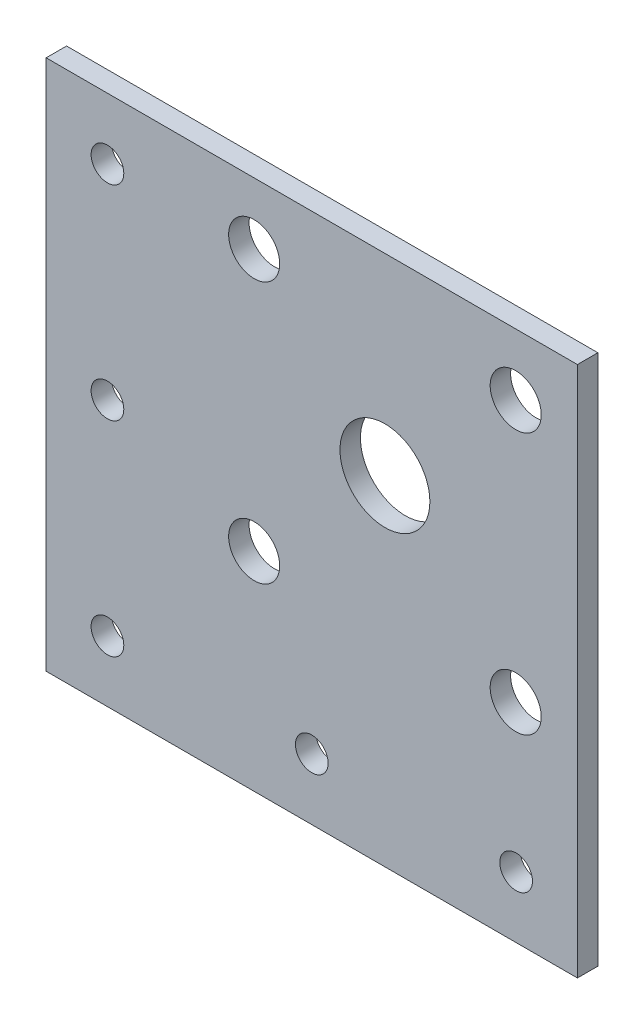
ISO-10303-21;
HEADER;
FILE_DESCRIPTION(('STEP AP214'),'2;1');
FILE_NAME('part.step','',(''),(''),'','','');
FILE_SCHEMA(('AUTOMOTIVE_DESIGN { 1 0 10303 214 1 1 1 1 }'));
ENDSEC;
DATA;
#1=APPLICATION_CONTEXT('core data for automotive mechanical design processes');
#2=APPLICATION_PROTOCOL_DEFINITION('international standard','automotive_design',2000,#1);
#3=PRODUCT_CONTEXT('',#1,'mechanical');
#4=PRODUCT('Part','Part','',(#3));
#5=PRODUCT_RELATED_PRODUCT_CATEGORY('part','',(#4));
#6=PRODUCT_DEFINITION_FORMATION('','',#4);
#7=PRODUCT_DEFINITION_CONTEXT('part definition',#1,'design');
#8=PRODUCT_DEFINITION('design','',#6,#7);
#9=PRODUCT_DEFINITION_SHAPE('','',#8);
#10=(LENGTH_UNIT() NAMED_UNIT(*) SI_UNIT(.MILLI.,.METRE.));
#11=(NAMED_UNIT(*) PLANE_ANGLE_UNIT() SI_UNIT($,.RADIAN.));
#12=(NAMED_UNIT(*) SI_UNIT($,.STERADIAN.) SOLID_ANGLE_UNIT());
#13=UNCERTAINTY_MEASURE_WITH_UNIT(LENGTH_MEASURE(1.E-05),#10,'distance_accuracy_value','');
#14=(GEOMETRIC_REPRESENTATION_CONTEXT(3) GLOBAL_UNCERTAINTY_ASSIGNED_CONTEXT((#13)) GLOBAL_UNIT_ASSIGNED_CONTEXT((#10,
#11,#12)) REPRESENTATION_CONTEXT('',''));
#15=CARTESIAN_POINT('',(0.,0.,0.));
#16=DIRECTION('',(0.,0.,1.));
#17=DIRECTION('',(1.,0.,0.));
#18=AXIS2_PLACEMENT_3D('',#15,#16,#17);
#19=CARTESIAN_POINT('',(0.,-82.9000000000001,5.));
#20=DIRECTION('',(0.,1.,0.));
#21=DIRECTION('',(0.,0.,1.));
#22=AXIS2_PLACEMENT_3D('',#19,#20,#21);
#23=PLANE('',#22);
#24=DIRECTION('',(1.,0.,0.));
#25=VECTOR('',#24,1.);
#26=CARTESIAN_POINT('',(0.,-82.9000000000001,0.));
#27=LINE('',#26,#25);
#28=CARTESIAN_POINT('',(-82.9,-82.9000000000001,0.));
#29=VERTEX_POINT('',#28);
#30=CARTESIAN_POINT('',(47.1000000000004,-82.9000000000001,0.));
#31=VERTEX_POINT('',#30);
#32=EDGE_CURVE('E150',#29,#31,#27,.T.);
#33=ORIENTED_EDGE('',*,*,#32,.T.);
#34=DIRECTION('',(0.,0.,-1.));
#35=VECTOR('',#34,1.);
#36=CARTESIAN_POINT('',(47.1000000000004,-82.9000000000001,5.));
#37=LINE('',#36,#35);
#38=CARTESIAN_POINT('',(47.1000000000004,-82.9000000000001,5.));
#39=VERTEX_POINT('',#38);
#40=EDGE_CURVE('E11',#39,#31,#37,.T.);
#41=ORIENTED_EDGE('',*,*,#40,.F.);
#42=DIRECTION('',(1.,0.,0.));
#43=VECTOR('',#42,1.);
#44=CARTESIAN_POINT('',(0.,-82.9000000000001,5.));
#45=LINE('',#44,#43);
#46=CARTESIAN_POINT('',(-82.9,-82.9000000000001,5.));
#47=VERTEX_POINT('',#46);
#48=EDGE_CURVE('E91',#47,#39,#45,.T.);
#49=ORIENTED_EDGE('',*,*,#48,.F.);
#50=DIRECTION('',(0.,0.,-1.));
#51=VECTOR('',#50,1.);
#52=CARTESIAN_POINT('',(-82.9,-82.9000000000001,5.));
#53=LINE('',#52,#51);
#54=EDGE_CURVE('E137',#47,#29,#53,.T.);
#55=ORIENTED_EDGE('',*,*,#54,.T.);
#56=EDGE_LOOP('',(#33,#41,#49,#55));
#57=FACE_BOUND('',#56,.T.);
#58=ADVANCED_FACE('F41',(#57),#23,.F.);
#59=CARTESIAN_POINT('',(47.1000000000004,0.,5.));
#60=DIRECTION('',(-1.,0.,0.));
#61=DIRECTION('',(0.,0.,1.));
#62=AXIS2_PLACEMENT_3D('',#59,#60,#61);
#63=PLANE('',#62);
#64=DIRECTION('',(0.,1.,0.));
#65=VECTOR('',#64,1.);
#66=CARTESIAN_POINT('',(47.1000000000004,0.,0.));
#67=LINE('',#66,#65);
#68=CARTESIAN_POINT('',(47.1000000000004,47.0999999999999,0.));
#69=VERTEX_POINT('',#68);
#70=EDGE_CURVE('E97',#31,#69,#67,.T.);
#71=ORIENTED_EDGE('',*,*,#70,.T.);
#72=DIRECTION('',(0.,0.,-1.));
#73=VECTOR('',#72,1.);
#74=CARTESIAN_POINT('',(47.1000000000004,47.0999999999999,5.));
#75=LINE('',#74,#73);
#76=CARTESIAN_POINT('',(47.1000000000004,47.0999999999999,5.));
#77=VERTEX_POINT('',#76);
#78=EDGE_CURVE('E51',#77,#69,#75,.T.);
#79=ORIENTED_EDGE('',*,*,#78,.F.);
#80=DIRECTION('',(0.,1.,0.));
#81=VECTOR('',#80,1.);
#82=CARTESIAN_POINT('',(47.1000000000004,0.,5.));
#83=LINE('',#82,#81);
#84=EDGE_CURVE('E85',#39,#77,#83,.T.);
#85=ORIENTED_EDGE('',*,*,#84,.F.);
#86=ORIENTED_EDGE('',*,*,#40,.T.);
#87=EDGE_LOOP('',(#71,#79,#85,#86));
#88=FACE_BOUND('',#87,.T.);
#89=ADVANCED_FACE('F96',(#88),#63,.F.);
#90=CARTESIAN_POINT('',(0.,47.0999999999999,5.));
#91=DIRECTION('',(0.,1.,0.));
#92=DIRECTION('',(0.,0.,1.));
#93=AXIS2_PLACEMENT_3D('',#90,#91,#92);
#94=PLANE('',#93);
#95=DIRECTION('',(1.,0.,0.));
#96=VECTOR('',#95,1.);
#97=CARTESIAN_POINT('',(0.,47.0999999999999,0.));
#98=LINE('',#97,#96);
#99=CARTESIAN_POINT('',(-82.8999999999996,47.0999999999999,0.));
#100=VERTEX_POINT('',#99);
#101=EDGE_CURVE('E156',#100,#69,#98,.T.);
#102=ORIENTED_EDGE('',*,*,#101,.F.);
#103=DIRECTION('',(0.,0.,-1.));
#104=VECTOR('',#103,1.);
#105=CARTESIAN_POINT('',(-82.8999999999996,47.0999999999999,5.));
#106=LINE('',#105,#104);
#107=CARTESIAN_POINT('',(-82.8999999999996,47.0999999999999,5.));
#108=VERTEX_POINT('',#107);
#109=EDGE_CURVE('E75',#108,#100,#106,.T.);
#110=ORIENTED_EDGE('',*,*,#109,.F.);
#111=DIRECTION('',(1.,0.,0.));
#112=VECTOR('',#111,1.);
#113=CARTESIAN_POINT('',(0.,47.0999999999999,5.));
#114=LINE('',#113,#112);
#115=EDGE_CURVE('E89',#108,#77,#114,.T.);
#116=ORIENTED_EDGE('',*,*,#115,.T.);
#117=ORIENTED_EDGE('',*,*,#78,.T.);
#118=EDGE_LOOP('',(#102,#110,#116,#117));
#119=FACE_BOUND('',#118,.T.);
#120=ADVANCED_FACE('F102',(#119),#94,.T.);
#121=CARTESIAN_POINT('',(-67.8999999999996,-17.9000000000001,5.));
#122=DIRECTION('',(0.,0.,-1.));
#123=DIRECTION('',(-1.,0.,0.));
#124=AXIS2_PLACEMENT_3D('',#121,#122,#123);
#125=CYLINDRICAL_SURFACE('',#124,4.00000000000001);
#126=CARTESIAN_POINT('',(-67.8999999999996,-17.9000000000001,5.));
#127=DIRECTION('',(0.,0.,1.));
#128=DIRECTION('',(1.,0.,0.));
#129=AXIS2_PLACEMENT_3D('',#126,#127,#128);
#130=CIRCLE('',#129,4.00000000000001);
#131=CARTESIAN_POINT('',(-63.8999999999996,-17.9000000000001,5.));
#132=VERTEX_POINT('',#131);
#133=EDGE_CURVE('E129',#132,#132,#130,.T.);
#134=ORIENTED_EDGE('',*,*,#133,.T.);
#135=EDGE_LOOP('',(#134));
#136=FACE_BOUND('',#135,.T.);
#137=CARTESIAN_POINT('',(-67.8999999999996,-17.9000000000001,0.));
#138=DIRECTION('',(0.,0.,1.));
#139=DIRECTION('',(1.,0.,0.));
#140=AXIS2_PLACEMENT_3D('',#137,#138,#139);
#141=CIRCLE('',#140,4.00000000000001);
#142=CARTESIAN_POINT('',(-63.8999999999996,-17.9000000000001,0.));
#143=VERTEX_POINT('',#142);
#144=EDGE_CURVE('E181',#143,#143,#141,.T.);
#145=ORIENTED_EDGE('',*,*,#144,.F.);
#146=EDGE_LOOP('',(#145));
#147=FACE_BOUND('',#146,.T.);
#148=ADVANCED_FACE('F359',(#136,#147),#125,.F.);
#149=CARTESIAN_POINT('',(-67.8999999999996,32.0999999999999,5.));
#150=DIRECTION('',(0.,0.,-1.));
#151=DIRECTION('',(-1.,0.,0.));
#152=AXIS2_PLACEMENT_3D('',#149,#150,#151);
#153=CYLINDRICAL_SURFACE('',#152,4.00000000000001);
#154=CARTESIAN_POINT('',(-67.8999999999996,32.0999999999999,5.));
#155=DIRECTION('',(0.,0.,1.));
#156=DIRECTION('',(1.,0.,0.));
#157=AXIS2_PLACEMENT_3D('',#154,#155,#156);
#158=CIRCLE('',#157,4.00000000000001);
#159=CARTESIAN_POINT('',(-63.8999999999996,32.0999999999999,5.));
#160=VERTEX_POINT('',#159);
#161=EDGE_CURVE('E125',#160,#160,#158,.T.);
#162=ORIENTED_EDGE('',*,*,#161,.T.);
#163=EDGE_LOOP('',(#162));
#164=FACE_BOUND('',#163,.T.);
#165=CARTESIAN_POINT('',(-67.8999999999996,32.0999999999999,0.));
#166=DIRECTION('',(0.,0.,1.));
#167=DIRECTION('',(1.,0.,0.));
#168=AXIS2_PLACEMENT_3D('',#165,#166,#167);
#169=CIRCLE('',#168,4.00000000000001);
#170=CARTESIAN_POINT('',(-63.8999999999996,32.0999999999999,0.));
#171=VERTEX_POINT('',#170);
#172=EDGE_CURVE('E177',#171,#171,#169,.T.);
#173=ORIENTED_EDGE('',*,*,#172,.F.);
#174=EDGE_LOOP('',(#173));
#175=FACE_BOUND('',#174,.T.);
#176=ADVANCED_FACE('F349',(#164,#175),#153,.F.);
#177=CARTESIAN_POINT('',(32.,-32.0000000000004,5.));
#178=DIRECTION('',(0.,0.,-1.));
#179=DIRECTION('',(-1.,0.,0.));
#180=AXIS2_PLACEMENT_3D('',#177,#178,#179);
#181=CYLINDRICAL_SURFACE('',#180,6.25);
#182=CARTESIAN_POINT('',(32.,-32.0000000000004,5.));
#183=DIRECTION('',(0.,0.,1.));
#184=DIRECTION('',(1.,0.,0.));
#185=AXIS2_PLACEMENT_3D('',#182,#183,#184);
#186=CIRCLE('',#185,6.25);
#187=CARTESIAN_POINT('',(38.25,-32.0000000000004,5.));
#188=VERTEX_POINT('',#187);
#189=EDGE_CURVE('E121',#188,#188,#186,.T.);
#190=ORIENTED_EDGE('',*,*,#189,.T.);
#191=EDGE_LOOP('',(#190));
#192=FACE_BOUND('',#191,.T.);
#193=CARTESIAN_POINT('',(32.,-32.0000000000004,0.));
#194=DIRECTION('',(0.,0.,1.));
#195=DIRECTION('',(1.,0.,0.));
#196=AXIS2_PLACEMENT_3D('',#193,#194,#195);
#197=CIRCLE('',#196,6.25);
#198=CARTESIAN_POINT('',(38.25,-32.0000000000004,0.));
#199=VERTEX_POINT('',#198);
#200=EDGE_CURVE('E173',#199,#199,#197,.T.);
#201=ORIENTED_EDGE('',*,*,#200,.F.);
#202=EDGE_LOOP('',(#201));
#203=FACE_BOUND('',#202,.T.);
#204=ADVANCED_FACE('F339',(#192,#203),#181,.F.);
#205=CARTESIAN_POINT('',(32.,31.9999999999996,5.));
#206=DIRECTION('',(0.,0.,-1.));
#207=DIRECTION('',(-1.,0.,0.));
#208=AXIS2_PLACEMENT_3D('',#205,#206,#207);
#209=CYLINDRICAL_SURFACE('',#208,6.25);
#210=CARTESIAN_POINT('',(32.,31.9999999999996,5.));
#211=DIRECTION('',(0.,0.,1.));
#212=DIRECTION('',(1.,0.,0.));
#213=AXIS2_PLACEMENT_3D('',#210,#211,#212);
#214=CIRCLE('',#213,6.25);
#215=CARTESIAN_POINT('',(38.25,31.9999999999996,5.));
#216=VERTEX_POINT('',#215);
#217=EDGE_CURVE('E117',#216,#216,#214,.T.);
#218=ORIENTED_EDGE('',*,*,#217,.T.);
#219=EDGE_LOOP('',(#218));
#220=FACE_BOUND('',#219,.T.);
#221=CARTESIAN_POINT('',(32.,31.9999999999996,0.));
#222=DIRECTION('',(0.,0.,1.));
#223=DIRECTION('',(1.,0.,0.));
#224=AXIS2_PLACEMENT_3D('',#221,#222,#223);
#225=CIRCLE('',#224,6.25);
#226=CARTESIAN_POINT('',(38.25,31.9999999999996,0.));
#227=VERTEX_POINT('',#226);
#228=EDGE_CURVE('E169',#227,#227,#225,.T.);
#229=ORIENTED_EDGE('',*,*,#228,.F.);
#230=EDGE_LOOP('',(#229));
#231=FACE_BOUND('',#230,.T.);
#232=ADVANCED_FACE('F329',(#220,#231),#209,.F.);
#233=CARTESIAN_POINT('',(-32.,31.9999999999996,5.));
#234=DIRECTION('',(0.,0.,-1.));
#235=DIRECTION('',(-1.,0.,0.));
#236=AXIS2_PLACEMENT_3D('',#233,#234,#235);
#237=CYLINDRICAL_SURFACE('',#236,6.25000000000001);
#238=CARTESIAN_POINT('',(-32.,31.9999999999996,5.));
#239=DIRECTION('',(0.,0.,1.));
#240=DIRECTION('',(1.,0.,0.));
#241=AXIS2_PLACEMENT_3D('',#238,#239,#240);
#242=CIRCLE('',#241,6.25000000000001);
#243=CARTESIAN_POINT('',(-25.75,31.9999999999996,5.));
#244=VERTEX_POINT('',#243);
#245=EDGE_CURVE('E113',#244,#244,#242,.T.);
#246=ORIENTED_EDGE('',*,*,#245,.T.);
#247=EDGE_LOOP('',(#246));
#248=FACE_BOUND('',#247,.T.);
#249=CARTESIAN_POINT('',(-32.,31.9999999999996,0.));
#250=DIRECTION('',(0.,0.,1.));
#251=DIRECTION('',(1.,0.,0.));
#252=AXIS2_PLACEMENT_3D('',#249,#250,#251);
#253=CIRCLE('',#252,6.25000000000001);
#254=CARTESIAN_POINT('',(-25.75,31.9999999999996,0.));
#255=VERTEX_POINT('',#254);
#256=EDGE_CURVE('E165',#255,#255,#253,.T.);
#257=ORIENTED_EDGE('',*,*,#256,.F.);
#258=EDGE_LOOP('',(#257));
#259=FACE_BOUND('',#258,.T.);
#260=ADVANCED_FACE('F319',(#248,#259),#237,.F.);
#261=CARTESIAN_POINT('',(-32.,-32.0000000000004,5.));
#262=DIRECTION('',(0.,0.,-1.));
#263=DIRECTION('',(-1.,0.,0.));
#264=AXIS2_PLACEMENT_3D('',#261,#262,#263);
#265=CYLINDRICAL_SURFACE('',#264,6.25);
#266=CARTESIAN_POINT('',(-32.,-32.0000000000004,5.));
#267=DIRECTION('',(0.,0.,1.));
#268=DIRECTION('',(1.,0.,0.));
#269=AXIS2_PLACEMENT_3D('',#266,#267,#268);
#270=CIRCLE('',#269,6.25);
#271=CARTESIAN_POINT('',(-25.75,-32.0000000000004,5.));
#272=VERTEX_POINT('',#271);
#273=EDGE_CURVE('E106',#272,#272,#270,.T.);
#274=ORIENTED_EDGE('',*,*,#273,.T.);
#275=EDGE_LOOP('',(#274));
#276=FACE_BOUND('',#275,.T.);
#277=CARTESIAN_POINT('',(-32.,-32.0000000000004,0.));
#278=DIRECTION('',(0.,0.,1.));
#279=DIRECTION('',(1.,0.,0.));
#280=AXIS2_PLACEMENT_3D('',#277,#278,#279);
#281=CIRCLE('',#280,6.25);
#282=CARTESIAN_POINT('',(-25.75,-32.0000000000004,0.));
#283=VERTEX_POINT('',#282);
#284=EDGE_CURVE('E161',#283,#283,#281,.T.);
#285=ORIENTED_EDGE('',*,*,#284,.F.);
#286=EDGE_LOOP('',(#285));
#287=FACE_BOUND('',#286,.T.);
#288=ADVANCED_FACE('F308',(#276,#287),#265,.F.);
#289=CARTESIAN_POINT('',(-82.8999999999997,2.6549275598488E-13,5.));
#290=DIRECTION('',(1.,0.,0.));
#291=DIRECTION('',(0.,1.,0.));
#292=AXIS2_PLACEMENT_3D('',#289,#290,#291);
#293=PLANE('',#292);
#294=DIRECTION('',(0.,-1.,0.));
#295=VECTOR('',#294,1.);
#296=CARTESIAN_POINT('',(-82.8999999999997,2.6549275598488E-13,0.));
#297=LINE('',#296,#295);
#298=EDGE_CURVE('E78',#100,#29,#297,.T.);
#299=ORIENTED_EDGE('',*,*,#298,.T.);
#300=ORIENTED_EDGE('',*,*,#54,.F.);
#301=DIRECTION('',(0.,-1.,0.));
#302=VECTOR('',#301,1.);
#303=CARTESIAN_POINT('',(-82.8999999999997,2.6549275598488E-13,5.));
#304=LINE('',#303,#302);
#305=EDGE_CURVE('E59',#108,#47,#304,.T.);
#306=ORIENTED_EDGE('',*,*,#305,.F.);
#307=ORIENTED_EDGE('',*,*,#109,.T.);
#308=EDGE_LOOP('',(#299,#300,#306,#307));
#309=FACE_BOUND('',#308,.T.);
#310=ADVANCED_FACE('F239',(#309),#293,.F.);
#311=CARTESIAN_POINT('',(-17.8999999999996,-67.9000000000001,5.));
#312=DIRECTION('',(0.,0.,-1.));
#313=DIRECTION('',(-1.,0.,0.));
#314=AXIS2_PLACEMENT_3D('',#311,#312,#313);
#315=CYLINDRICAL_SURFACE('',#314,4.);
#316=CARTESIAN_POINT('',(-17.8999999999996,-67.9000000000001,5.));
#317=DIRECTION('',(0.,0.,1.));
#318=DIRECTION('',(1.,0.,0.));
#319=AXIS2_PLACEMENT_3D('',#316,#317,#318);
#320=CIRCLE('',#319,4.);
#321=CARTESIAN_POINT('',(-13.8999999999996,-67.9000000000001,5.));
#322=VERTEX_POINT('',#321);
#323=EDGE_CURVE('E256',#322,#322,#320,.T.);
#324=ORIENTED_EDGE('',*,*,#323,.T.);
#325=EDGE_LOOP('',(#324));
#326=FACE_BOUND('',#325,.T.);
#327=CARTESIAN_POINT('',(-17.8999999999996,-67.9000000000001,0.));
#328=DIRECTION('',(0.,0.,1.));
#329=DIRECTION('',(1.,0.,0.));
#330=AXIS2_PLACEMENT_3D('',#327,#328,#329);
#331=CIRCLE('',#330,4.);
#332=CARTESIAN_POINT('',(-13.8999999999996,-67.9000000000001,0.));
#333=VERTEX_POINT('',#332);
#334=EDGE_CURVE('E146',#333,#333,#331,.T.);
#335=ORIENTED_EDGE('',*,*,#334,.F.);
#336=EDGE_LOOP('',(#335));
#337=FACE_BOUND('',#336,.T.);
#338=ADVANCED_FACE('F237',(#326,#337),#315,.F.);
#339=CARTESIAN_POINT('',(32.1000000000004,-67.9000000000001,5.));
#340=DIRECTION('',(0.,0.,-1.));
#341=DIRECTION('',(-1.,0.,0.));
#342=AXIS2_PLACEMENT_3D('',#339,#340,#341);
#343=CYLINDRICAL_SURFACE('',#342,3.99999999999999);
#344=CARTESIAN_POINT('',(32.1000000000004,-67.9000000000001,5.));
#345=DIRECTION('',(0.,0.,1.));
#346=DIRECTION('',(1.,0.,0.));
#347=AXIS2_PLACEMENT_3D('',#344,#345,#346);
#348=CIRCLE('',#347,3.99999999999999);
#349=CARTESIAN_POINT('',(36.1000000000004,-67.9000000000001,5.));
#350=VERTEX_POINT('',#349);
#351=EDGE_CURVE('E248',#350,#350,#348,.T.);
#352=ORIENTED_EDGE('',*,*,#351,.T.);
#353=EDGE_LOOP('',(#352));
#354=FACE_BOUND('',#353,.T.);
#355=CARTESIAN_POINT('',(32.1000000000004,-67.9000000000001,0.));
#356=DIRECTION('',(0.,0.,1.));
#357=DIRECTION('',(1.,0.,0.));
#358=AXIS2_PLACEMENT_3D('',#355,#356,#357);
#359=CIRCLE('',#358,3.99999999999999);
#360=CARTESIAN_POINT('',(36.1000000000004,-67.9000000000001,0.));
#361=VERTEX_POINT('',#360);
#362=EDGE_CURVE('E142',#361,#361,#359,.T.);
#363=ORIENTED_EDGE('',*,*,#362,.F.);
#364=EDGE_LOOP('',(#363));
#365=FACE_BOUND('',#364,.T.);
#366=ADVANCED_FACE('F225',(#354,#365),#343,.F.);
#367=CARTESIAN_POINT('',(0.,0.,5.));
#368=DIRECTION('',(0.,0.,-1.));
#369=DIRECTION('',(-1.,0.,0.));
#370=AXIS2_PLACEMENT_3D('',#367,#368,#369);
#371=CYLINDRICAL_SURFACE('',#370,11.);
#372=CARTESIAN_POINT('',(0.,0.,5.));
#373=DIRECTION('',(0.,0.,1.));
#374=DIRECTION('',(1.,0.,0.));
#375=AXIS2_PLACEMENT_3D('',#372,#373,#374);
#376=CIRCLE('',#375,11.);
#377=CARTESIAN_POINT('',(11.,0.,5.));
#378=VERTEX_POINT('',#377);
#379=EDGE_CURVE('E189',#378,#378,#376,.T.);
#380=ORIENTED_EDGE('',*,*,#379,.T.);
#381=EDGE_LOOP('',(#380));
#382=FACE_BOUND('',#381,.T.);
#383=CARTESIAN_POINT('',(0.,0.,0.));
#384=DIRECTION('',(0.,0.,1.));
#385=DIRECTION('',(1.,0.,0.));
#386=AXIS2_PLACEMENT_3D('',#383,#384,#385);
#387=CIRCLE('',#386,11.);
#388=CARTESIAN_POINT('',(11.,0.,0.));
#389=VERTEX_POINT('',#388);
#390=EDGE_CURVE('E138',#389,#389,#387,.T.);
#391=ORIENTED_EDGE('',*,*,#390,.F.);
#392=EDGE_LOOP('',(#391));
#393=FACE_BOUND('',#392,.T.);
#394=ADVANCED_FACE('F43',(#382,#393),#371,.F.);
#395=CARTESIAN_POINT('',(-67.8999999999996,-67.9000000000001,5.));
#396=DIRECTION('',(0.,0.,-1.));
#397=DIRECTION('',(-1.,0.,0.));
#398=AXIS2_PLACEMENT_3D('',#395,#396,#397);
#399=CYLINDRICAL_SURFACE('',#398,4.00000000000001);
#400=CARTESIAN_POINT('',(-67.8999999999996,-67.9000000000001,5.));
#401=DIRECTION('',(0.,0.,1.));
#402=DIRECTION('',(1.,0.,0.));
#403=AXIS2_PLACEMENT_3D('',#400,#401,#402);
#404=CIRCLE('',#403,4.00000000000001);
#405=CARTESIAN_POINT('',(-63.8999999999996,-67.9000000000001,5.));
#406=VERTEX_POINT('',#405);
#407=EDGE_CURVE('E133',#406,#406,#404,.F.);
#408=ORIENTED_EDGE('',*,*,#407,.F.);
#409=EDGE_LOOP('',(#408));
#410=FACE_BOUND('',#409,.T.);
#411=CARTESIAN_POINT('',(-67.8999999999996,-67.9000000000001,0.));
#412=DIRECTION('',(0.,0.,1.));
#413=DIRECTION('',(1.,0.,0.));
#414=AXIS2_PLACEMENT_3D('',#411,#412,#413);
#415=CIRCLE('',#414,4.00000000000001);
#416=CARTESIAN_POINT('',(-63.8999999999996,-67.9000000000001,0.));
#417=VERTEX_POINT('',#416);
#418=EDGE_CURVE('E185',#417,#417,#415,.F.);
#419=ORIENTED_EDGE('',*,*,#418,.T.);
#420=EDGE_LOOP('',(#419));
#421=FACE_BOUND('',#420,.T.);
#422=ADVANCED_FACE('F215',(#410,#421),#399,.F.);
#423=CARTESIAN_POINT('',(0.,0.,5.));
#424=DIRECTION('',(0.,0.,1.));
#425=DIRECTION('',(1.,0.,0.));
#426=AXIS2_PLACEMENT_3D('',#423,#424,#425);
#427=PLANE('',#426);
#428=ORIENTED_EDGE('',*,*,#379,.F.);
#429=EDGE_LOOP('',(#428));
#430=FACE_BOUND('',#429,.T.);
#431=ORIENTED_EDGE('',*,*,#351,.F.);
#432=EDGE_LOOP('',(#431));
#433=FACE_BOUND('',#432,.T.);
#434=ORIENTED_EDGE('',*,*,#323,.F.);
#435=EDGE_LOOP('',(#434));
#436=FACE_BOUND('',#435,.T.);
#437=ORIENTED_EDGE('',*,*,#48,.T.);
#438=ORIENTED_EDGE('',*,*,#84,.T.);
#439=ORIENTED_EDGE('',*,*,#115,.F.);
#440=ORIENTED_EDGE('',*,*,#305,.T.);
#441=EDGE_LOOP('',(#437,#438,#439,#440));
#442=FACE_BOUND('',#441,.T.);
#443=ORIENTED_EDGE('',*,*,#273,.F.);
#444=EDGE_LOOP('',(#443));
#445=FACE_BOUND('',#444,.T.);
#446=ORIENTED_EDGE('',*,*,#245,.F.);
#447=EDGE_LOOP('',(#446));
#448=FACE_BOUND('',#447,.T.);
#449=ORIENTED_EDGE('',*,*,#217,.F.);
#450=EDGE_LOOP('',(#449));
#451=FACE_BOUND('',#450,.T.);
#452=ORIENTED_EDGE('',*,*,#189,.F.);
#453=EDGE_LOOP('',(#452));
#454=FACE_BOUND('',#453,.T.);
#455=ORIENTED_EDGE('',*,*,#161,.F.);
#456=EDGE_LOOP('',(#455));
#457=FACE_BOUND('',#456,.T.);
#458=ORIENTED_EDGE('',*,*,#133,.F.);
#459=EDGE_LOOP('',(#458));
#460=FACE_BOUND('',#459,.T.);
#461=ORIENTED_EDGE('',*,*,#407,.T.);
#462=EDGE_LOOP('',(#461));
#463=FACE_BOUND('',#462,.T.);
#464=ADVANCED_FACE('F86',(#430,#433,#436,#442,#445,#448,#451,#454,#457,#460,#463),#427,.T.);
#465=CARTESIAN_POINT('',(0.,0.,0.));
#466=DIRECTION('',(0.,0.,1.));
#467=DIRECTION('',(1.,0.,0.));
#468=AXIS2_PLACEMENT_3D('',#465,#466,#467);
#469=PLANE('',#468);
#470=ORIENTED_EDGE('',*,*,#390,.T.);
#471=EDGE_LOOP('',(#470));
#472=FACE_BOUND('',#471,.T.);
#473=ORIENTED_EDGE('',*,*,#362,.T.);
#474=EDGE_LOOP('',(#473));
#475=FACE_BOUND('',#474,.T.);
#476=ORIENTED_EDGE('',*,*,#334,.T.);
#477=EDGE_LOOP('',(#476));
#478=FACE_BOUND('',#477,.T.);
#479=ORIENTED_EDGE('',*,*,#32,.F.);
#480=ORIENTED_EDGE('',*,*,#298,.F.);
#481=ORIENTED_EDGE('',*,*,#101,.T.);
#482=ORIENTED_EDGE('',*,*,#70,.F.);
#483=EDGE_LOOP('',(#479,#480,#481,#482));
#484=FACE_BOUND('',#483,.T.);
#485=ORIENTED_EDGE('',*,*,#284,.T.);
#486=EDGE_LOOP('',(#485));
#487=FACE_BOUND('',#486,.T.);
#488=ORIENTED_EDGE('',*,*,#256,.T.);
#489=EDGE_LOOP('',(#488));
#490=FACE_BOUND('',#489,.T.);
#491=ORIENTED_EDGE('',*,*,#228,.T.);
#492=EDGE_LOOP('',(#491));
#493=FACE_BOUND('',#492,.T.);
#494=ORIENTED_EDGE('',*,*,#200,.T.);
#495=EDGE_LOOP('',(#494));
#496=FACE_BOUND('',#495,.T.);
#497=ORIENTED_EDGE('',*,*,#172,.T.);
#498=EDGE_LOOP('',(#497));
#499=FACE_BOUND('',#498,.T.);
#500=ORIENTED_EDGE('',*,*,#144,.T.);
#501=EDGE_LOOP('',(#500));
#502=FACE_BOUND('',#501,.T.);
#503=ORIENTED_EDGE('',*,*,#418,.F.);
#504=EDGE_LOOP('',(#503));
#505=FACE_BOUND('',#504,.T.);
#506=ADVANCED_FACE('F196',(#472,#475,#478,#484,#487,#490,#493,#496,#499,#502,#505),#469,.F.);
#507=CLOSED_SHELL('',(#58,#89,#120,#148,#176,#204,#232,#260,#288,#310,#338,#366,#394,#422,#464,#506));
#508=MANIFOLD_SOLID_BREP('B2',#507);
#509=ADVANCED_BREP_SHAPE_REPRESENTATION('',(#18,#508),#14);
#510=SHAPE_DEFINITION_REPRESENTATION(#9,#509);
ENDSEC;
END-ISO-10303-21;
